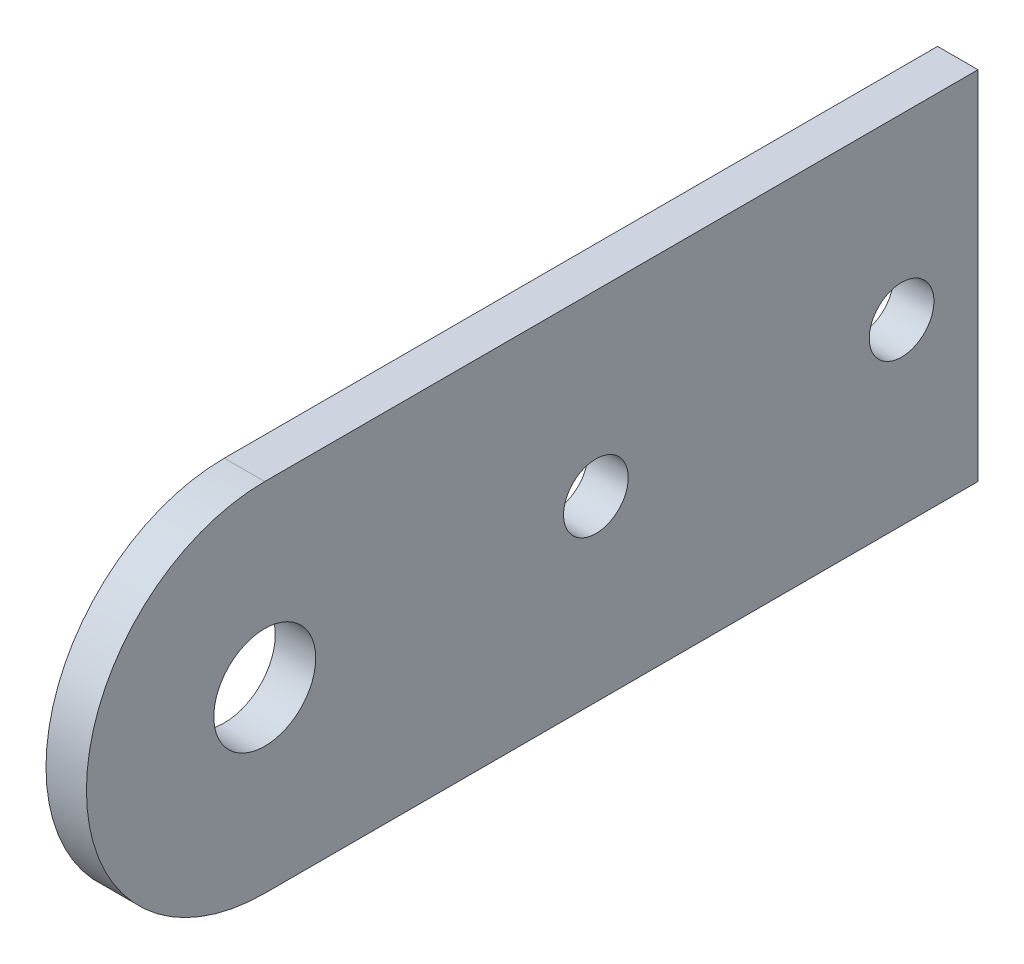
ISO-10303-21;
HEADER;
FILE_DESCRIPTION(('STEP AP214'),'2;1');
FILE_NAME('part.step','',(''),(''),'','','');
FILE_SCHEMA(('AUTOMOTIVE_DESIGN { 1 0 10303 214 1 1 1 1 }'));
ENDSEC;
DATA;
#1=APPLICATION_CONTEXT('core data for automotive mechanical design processes');
#2=APPLICATION_PROTOCOL_DEFINITION('international standard','automotive_design',2000,#1);
#3=PRODUCT_CONTEXT('',#1,'mechanical');
#4=PRODUCT('Part','Part','',(#3));
#5=PRODUCT_RELATED_PRODUCT_CATEGORY('part','',(#4));
#6=PRODUCT_DEFINITION_FORMATION('','',#4);
#7=PRODUCT_DEFINITION_CONTEXT('part definition',#1,'design');
#8=PRODUCT_DEFINITION('design','',#6,#7);
#9=PRODUCT_DEFINITION_SHAPE('','',#8);
#10=(LENGTH_UNIT() NAMED_UNIT(*) SI_UNIT(.MILLI.,.METRE.));
#11=(NAMED_UNIT(*) PLANE_ANGLE_UNIT() SI_UNIT($,.RADIAN.));
#12=(NAMED_UNIT(*) SI_UNIT($,.STERADIAN.) SOLID_ANGLE_UNIT());
#13=UNCERTAINTY_MEASURE_WITH_UNIT(LENGTH_MEASURE(1.E-05),#10,'distance_accuracy_value','');
#14=(GEOMETRIC_REPRESENTATION_CONTEXT(3) GLOBAL_UNCERTAINTY_ASSIGNED_CONTEXT((#13)) GLOBAL_UNIT_ASSIGNED_CONTEXT((#10,
#11,#12)) REPRESENTATION_CONTEXT('',''));
#15=CARTESIAN_POINT('',(0.,0.,0.));
#16=DIRECTION('',(0.,0.,1.));
#17=DIRECTION('',(1.,0.,0.));
#18=AXIS2_PLACEMENT_3D('',#15,#16,#17);
#19=CARTESIAN_POINT('',(7.9375,0.,0.));
#20=DIRECTION('',(-1.,0.,0.));
#21=DIRECTION('',(0.,0.,1.));
#22=AXIS2_PLACEMENT_3D('',#19,#20,#21);
#23=CYLINDRICAL_SURFACE('',#22,35.);
#24=CARTESIAN_POINT('',(0.,0.,0.));
#25=DIRECTION('',(1.,0.,0.));
#26=DIRECTION('',(0.,0.,-1.));
#27=AXIS2_PLACEMENT_3D('',#24,#25,#26);
#28=CIRCLE('',#27,35.);
#29=CARTESIAN_POINT('',(0.,35.,0.));
#30=VERTEX_POINT('',#29);
#31=CARTESIAN_POINT('',(0.,-35.,0.));
#32=VERTEX_POINT('',#31);
#33=EDGE_CURVE('E109',#30,#32,#28,.T.);
#34=ORIENTED_EDGE('',*,*,#33,.T.);
#35=DIRECTION('',(-1.,0.,0.));
#36=VECTOR('',#35,1.);
#37=CARTESIAN_POINT('',(7.9375,-35.,0.));
#38=LINE('',#37,#36);
#39=CARTESIAN_POINT('',(7.9375,-35.,0.));
#40=VERTEX_POINT('',#39);
#41=EDGE_CURVE('E11',#40,#32,#38,.T.);
#42=ORIENTED_EDGE('',*,*,#41,.F.);
#43=CARTESIAN_POINT('',(7.9375,0.,0.));
#44=DIRECTION('',(1.,0.,0.));
#45=DIRECTION('',(0.,0.,-1.));
#46=AXIS2_PLACEMENT_3D('',#43,#44,#45);
#47=CIRCLE('',#46,35.);
#48=CARTESIAN_POINT('',(7.9375,35.,0.));
#49=VERTEX_POINT('',#48);
#50=EDGE_CURVE('E86',#49,#40,#47,.T.);
#51=ORIENTED_EDGE('',*,*,#50,.F.);
#52=DIRECTION('',(-1.,0.,0.));
#53=VECTOR('',#52,1.);
#54=CARTESIAN_POINT('',(7.9375,35.,0.));
#55=LINE('',#54,#53);
#56=EDGE_CURVE('E52',#49,#30,#55,.T.);
#57=ORIENTED_EDGE('',*,*,#56,.T.);
#58=EDGE_LOOP('',(#34,#42,#51,#57));
#59=FACE_BOUND('',#58,.T.);
#60=ADVANCED_FACE('F35',(#59),#23,.T.);
#61=CARTESIAN_POINT('',(7.9375,-35.,0.));
#62=DIRECTION('',(0.,1.,0.));
#63=DIRECTION('',(0.,0.,1.));
#64=AXIS2_PLACEMENT_3D('',#61,#62,#63);
#65=PLANE('',#64);
#66=DIRECTION('',(0.,0.,-1.));
#67=VECTOR('',#66,1.);
#68=CARTESIAN_POINT('',(0.,-35.,0.));
#69=LINE('',#68,#67);
#70=CARTESIAN_POINT('',(0.,-35.,-140.));
#71=VERTEX_POINT('',#70);
#72=EDGE_CURVE('E91',#32,#71,#69,.T.);
#73=ORIENTED_EDGE('',*,*,#72,.T.);
#74=DIRECTION('',(-1.,0.,0.));
#75=VECTOR('',#74,1.);
#76=CARTESIAN_POINT('',(7.9375,-35.,-140.));
#77=LINE('',#76,#75);
#78=CARTESIAN_POINT('',(7.9375,-35.,-140.));
#79=VERTEX_POINT('',#78);
#80=EDGE_CURVE('E44',#79,#71,#77,.T.);
#81=ORIENTED_EDGE('',*,*,#80,.F.);
#82=DIRECTION('',(0.,0.,-1.));
#83=VECTOR('',#82,1.);
#84=CARTESIAN_POINT('',(7.9375,-35.,0.));
#85=LINE('',#84,#83);
#86=EDGE_CURVE('E77',#40,#79,#85,.T.);
#87=ORIENTED_EDGE('',*,*,#86,.F.);
#88=ORIENTED_EDGE('',*,*,#41,.T.);
#89=EDGE_LOOP('',(#73,#81,#87,#88));
#90=FACE_BOUND('',#89,.T.);
#91=ADVANCED_FACE('F90',(#90),#65,.F.);
#92=CARTESIAN_POINT('',(7.9375,0.,-140.));
#93=DIRECTION('',(0.,0.,-1.));
#94=DIRECTION('',(-1.,0.,0.));
#95=AXIS2_PLACEMENT_3D('',#92,#93,#94);
#96=PLANE('',#95);
#97=DIRECTION('',(0.,-1.,0.));
#98=VECTOR('',#97,1.);
#99=CARTESIAN_POINT('',(0.,0.,-140.));
#100=LINE('',#99,#98);
#101=CARTESIAN_POINT('',(0.,35.,-140.));
#102=VERTEX_POINT('',#101);
#103=EDGE_CURVE('E112',#102,#71,#100,.T.);
#104=ORIENTED_EDGE('',*,*,#103,.F.);
#105=DIRECTION('',(-1.,0.,0.));
#106=VECTOR('',#105,1.);
#107=CARTESIAN_POINT('',(7.9375,35.,-140.));
#108=LINE('',#107,#106);
#109=CARTESIAN_POINT('',(7.9375,35.,-140.));
#110=VERTEX_POINT('',#109);
#111=EDGE_CURVE('E66',#110,#102,#108,.T.);
#112=ORIENTED_EDGE('',*,*,#111,.F.);
#113=DIRECTION('',(0.,-1.,0.));
#114=VECTOR('',#113,1.);
#115=CARTESIAN_POINT('',(7.9375,0.,-140.));
#116=LINE('',#115,#114);
#117=EDGE_CURVE('E85',#110,#79,#116,.T.);
#118=ORIENTED_EDGE('',*,*,#117,.T.);
#119=ORIENTED_EDGE('',*,*,#80,.T.);
#120=EDGE_LOOP('',(#104,#112,#118,#119));
#121=FACE_BOUND('',#120,.T.);
#122=ADVANCED_FACE('F94',(#121),#96,.T.);
#123=CARTESIAN_POINT('',(7.9375,0.,-65.));
#124=DIRECTION('',(-1.,0.,0.));
#125=DIRECTION('',(0.,0.,1.));
#126=AXIS2_PLACEMENT_3D('',#123,#124,#125);
#127=CYLINDRICAL_SURFACE('',#126,6.35);
#128=CARTESIAN_POINT('',(7.9375,0.,-65.));
#129=DIRECTION('',(1.,0.,0.));
#130=DIRECTION('',(0.,0.,-1.));
#131=AXIS2_PLACEMENT_3D('',#128,#129,#130);
#132=CIRCLE('',#131,6.35);
#133=CARTESIAN_POINT('',(7.9375,0.,-71.35));
#134=VERTEX_POINT('',#133);
#135=EDGE_CURVE('E97',#134,#134,#132,.T.);
#136=ORIENTED_EDGE('',*,*,#135,.T.);
#137=EDGE_LOOP('',(#136));
#138=FACE_BOUND('',#137,.T.);
#139=CARTESIAN_POINT('',(0.,0.,-65.));
#140=DIRECTION('',(1.,0.,0.));
#141=DIRECTION('',(0.,0.,-1.));
#142=AXIS2_PLACEMENT_3D('',#139,#140,#141);
#143=CIRCLE('',#142,6.35);
#144=CARTESIAN_POINT('',(0.,0.,-71.35));
#145=VERTEX_POINT('',#144);
#146=EDGE_CURVE('E117',#145,#145,#143,.T.);
#147=ORIENTED_EDGE('',*,*,#146,.F.);
#148=EDGE_LOOP('',(#147));
#149=FACE_BOUND('',#148,.T.);
#150=ADVANCED_FACE('F153',(#138,#149),#127,.F.);
#151=CARTESIAN_POINT('',(7.9375,35.,0.));
#152=DIRECTION('',(0.,1.,0.));
#153=DIRECTION('',(0.,0.,1.));
#154=AXIS2_PLACEMENT_3D('',#151,#152,#153);
#155=PLANE('',#154);
#156=DIRECTION('',(0.,0.,-1.));
#157=VECTOR('',#156,1.);
#158=CARTESIAN_POINT('',(0.,35.,0.));
#159=LINE('',#158,#157);
#160=EDGE_CURVE('E114',#30,#102,#159,.T.);
#161=ORIENTED_EDGE('',*,*,#160,.F.);
#162=ORIENTED_EDGE('',*,*,#56,.F.);
#163=DIRECTION('',(0.,0.,-1.));
#164=VECTOR('',#163,1.);
#165=CARTESIAN_POINT('',(7.9375,35.,0.));
#166=LINE('',#165,#164);
#167=EDGE_CURVE('E95',#49,#110,#166,.T.);
#168=ORIENTED_EDGE('',*,*,#167,.T.);
#169=ORIENTED_EDGE('',*,*,#111,.T.);
#170=EDGE_LOOP('',(#161,#162,#168,#169));
#171=FACE_BOUND('',#170,.T.);
#172=ADVANCED_FACE('F154',(#171),#155,.T.);
#173=CARTESIAN_POINT('',(7.9375,0.,0.));
#174=DIRECTION('',(-1.,0.,0.));
#175=DIRECTION('',(0.,0.,1.));
#176=AXIS2_PLACEMENT_3D('',#173,#174,#175);
#177=CYLINDRICAL_SURFACE('',#176,10.);
#178=CARTESIAN_POINT('',(7.9375,0.,0.));
#179=DIRECTION('',(1.,0.,0.));
#180=DIRECTION('',(0.,0.,-1.));
#181=AXIS2_PLACEMENT_3D('',#178,#179,#180);
#182=CIRCLE('',#181,10.);
#183=CARTESIAN_POINT('',(7.9375,0.,-10.));
#184=VERTEX_POINT('',#183);
#185=EDGE_CURVE('E123',#184,#184,#182,.T.);
#186=ORIENTED_EDGE('',*,*,#185,.T.);
#187=EDGE_LOOP('',(#186));
#188=FACE_BOUND('',#187,.T.);
#189=CARTESIAN_POINT('',(0.,0.,0.));
#190=DIRECTION('',(1.,0.,0.));
#191=DIRECTION('',(0.,0.,-1.));
#192=AXIS2_PLACEMENT_3D('',#189,#190,#191);
#193=CIRCLE('',#192,10.);
#194=CARTESIAN_POINT('',(0.,0.,-10.));
#195=VERTEX_POINT('',#194);
#196=EDGE_CURVE('E106',#195,#195,#193,.T.);
#197=ORIENTED_EDGE('',*,*,#196,.F.);
#198=EDGE_LOOP('',(#197));
#199=FACE_BOUND('',#198,.T.);
#200=ADVANCED_FACE('F37',(#188,#199),#177,.F.);
#201=CARTESIAN_POINT('',(7.9375,0.,-125.));
#202=DIRECTION('',(-1.,0.,0.));
#203=DIRECTION('',(0.,0.,1.));
#204=AXIS2_PLACEMENT_3D('',#201,#202,#203);
#205=CYLINDRICAL_SURFACE('',#204,6.35);
#206=CARTESIAN_POINT('',(7.9375,0.,-125.));
#207=DIRECTION('',(1.,0.,0.));
#208=DIRECTION('',(0.,0.,-1.));
#209=AXIS2_PLACEMENT_3D('',#206,#207,#208);
#210=CIRCLE('',#209,6.35);
#211=CARTESIAN_POINT('',(7.9375,0.,-131.35));
#212=VERTEX_POINT('',#211);
#213=EDGE_CURVE('E103',#212,#212,#210,.T.);
#214=ORIENTED_EDGE('',*,*,#213,.T.);
#215=EDGE_LOOP('',(#214));
#216=FACE_BOUND('',#215,.T.);
#217=CARTESIAN_POINT('',(0.,0.,-125.));
#218=DIRECTION('',(1.,0.,0.));
#219=DIRECTION('',(0.,0.,-1.));
#220=AXIS2_PLACEMENT_3D('',#217,#218,#219);
#221=CIRCLE('',#220,6.35);
#222=CARTESIAN_POINT('',(0.,0.,-131.35));
#223=VERTEX_POINT('',#222);
#224=EDGE_CURVE('E120',#223,#223,#221,.T.);
#225=ORIENTED_EDGE('',*,*,#224,.F.);
#226=EDGE_LOOP('',(#225));
#227=FACE_BOUND('',#226,.T.);
#228=ADVANCED_FACE('F135',(#216,#227),#205,.F.);
#229=CARTESIAN_POINT('',(7.9375,0.,0.));
#230=DIRECTION('',(1.,0.,0.));
#231=DIRECTION('',(0.,0.,-1.));
#232=AXIS2_PLACEMENT_3D('',#229,#230,#231);
#233=PLANE('',#232);
#234=ORIENTED_EDGE('',*,*,#185,.F.);
#235=EDGE_LOOP('',(#234));
#236=FACE_BOUND('',#235,.T.);
#237=ORIENTED_EDGE('',*,*,#50,.T.);
#238=ORIENTED_EDGE('',*,*,#86,.T.);
#239=ORIENTED_EDGE('',*,*,#117,.F.);
#240=ORIENTED_EDGE('',*,*,#167,.F.);
#241=EDGE_LOOP('',(#237,#238,#239,#240));
#242=FACE_BOUND('',#241,.T.);
#243=ORIENTED_EDGE('',*,*,#135,.F.);
#244=EDGE_LOOP('',(#243));
#245=FACE_BOUND('',#244,.T.);
#246=ORIENTED_EDGE('',*,*,#213,.F.);
#247=EDGE_LOOP('',(#246));
#248=FACE_BOUND('',#247,.T.);
#249=ADVANCED_FACE('F81',(#236,#242,#245,#248),#233,.T.);
#250=CARTESIAN_POINT('',(0.,0.,0.));
#251=DIRECTION('',(1.,0.,0.));
#252=DIRECTION('',(0.,0.,-1.));
#253=AXIS2_PLACEMENT_3D('',#250,#251,#252);
#254=PLANE('',#253);
#255=ORIENTED_EDGE('',*,*,#196,.T.);
#256=EDGE_LOOP('',(#255));
#257=FACE_BOUND('',#256,.T.);
#258=ORIENTED_EDGE('',*,*,#33,.F.);
#259=ORIENTED_EDGE('',*,*,#160,.T.);
#260=ORIENTED_EDGE('',*,*,#103,.T.);
#261=ORIENTED_EDGE('',*,*,#72,.F.);
#262=EDGE_LOOP('',(#258,#259,#260,#261));
#263=FACE_BOUND('',#262,.T.);
#264=ORIENTED_EDGE('',*,*,#146,.T.);
#265=EDGE_LOOP('',(#264));
#266=FACE_BOUND('',#265,.T.);
#267=ORIENTED_EDGE('',*,*,#224,.T.);
#268=EDGE_LOOP('',(#267));
#269=FACE_BOUND('',#268,.T.);
#270=ADVANCED_FACE('F134',(#257,#263,#266,#269),#254,.F.);
#271=CLOSED_SHELL('',(#60,#91,#122,#150,#172,#200,#228,#249,#270));
#272=MANIFOLD_SOLID_BREP('B2',#271);
#273=ADVANCED_BREP_SHAPE_REPRESENTATION('',(#18,#272),#14);
#274=SHAPE_DEFINITION_REPRESENTATION(#9,#273);
ENDSEC;
END-ISO-10303-21;
